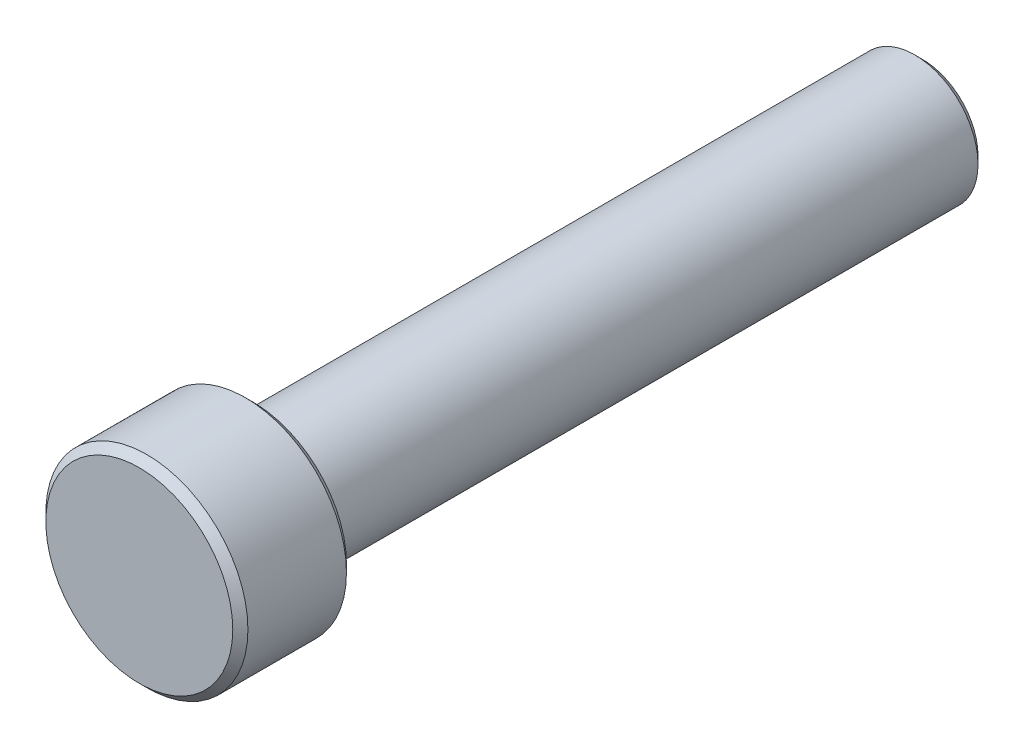
ISO-10303-21;
HEADER;
FILE_DESCRIPTION(('STEP AP214'),'2;1');
FILE_NAME('part.step','',(''),(''),'','','');
FILE_SCHEMA(('AUTOMOTIVE_DESIGN { 1 0 10303 214 1 1 1 1 }'));
ENDSEC;
DATA;
#1=APPLICATION_CONTEXT('core data for automotive mechanical design processes');
#2=APPLICATION_PROTOCOL_DEFINITION('international standard','automotive_design',2000,#1);
#3=PRODUCT_CONTEXT('',#1,'mechanical');
#4=PRODUCT('Part','Part','',(#3));
#5=PRODUCT_RELATED_PRODUCT_CATEGORY('part','',(#4));
#6=PRODUCT_DEFINITION_FORMATION('','',#4);
#7=PRODUCT_DEFINITION_CONTEXT('part definition',#1,'design');
#8=PRODUCT_DEFINITION('design','',#6,#7);
#9=PRODUCT_DEFINITION_SHAPE('','',#8);
#10=(LENGTH_UNIT() NAMED_UNIT(*) SI_UNIT(.MILLI.,.METRE.));
#11=(NAMED_UNIT(*) PLANE_ANGLE_UNIT() SI_UNIT($,.RADIAN.));
#12=(NAMED_UNIT(*) SI_UNIT($,.STERADIAN.) SOLID_ANGLE_UNIT());
#13=UNCERTAINTY_MEASURE_WITH_UNIT(LENGTH_MEASURE(1.E-05),#10,'distance_accuracy_value','');
#14=(GEOMETRIC_REPRESENTATION_CONTEXT(3) GLOBAL_UNCERTAINTY_ASSIGNED_CONTEXT((#13)) GLOBAL_UNIT_ASSIGNED_CONTEXT((#10,
#11,#12)) REPRESENTATION_CONTEXT('',''));
#15=CARTESIAN_POINT('',(0.,0.,0.));
#16=DIRECTION('',(0.,0.,1.));
#17=DIRECTION('',(1.,0.,0.));
#18=AXIS2_PLACEMENT_3D('',#15,#16,#17);
#19=CARTESIAN_POINT('',(0.,0.,26.5));
#20=DIRECTION('',(0.,0.,-1.));
#21=DIRECTION('',(-1.,0.,0.));
#22=AXIS2_PLACEMENT_3D('',#19,#20,#21);
#23=CYLINDRICAL_SURFACE('',#22,2.5);
#24=CARTESIAN_POINT('',(0.,0.,0.299999999999998));
#25=DIRECTION('',(0.,0.,1.));
#26=DIRECTION('',(1.,0.,0.));
#27=AXIS2_PLACEMENT_3D('',#24,#25,#26);
#28=CIRCLE('',#27,2.5);
#29=CARTESIAN_POINT('',(2.5,0.,0.299999999999998));
#30=VERTEX_POINT('',#29);
#31=EDGE_CURVE('E72',#30,#30,#28,.T.);
#32=ORIENTED_EDGE('',*,*,#31,.T.);
#33=EDGE_LOOP('',(#32));
#34=FACE_BOUND('',#33,.T.);
#35=CARTESIAN_POINT('',(0.,0.,26.5));
#36=DIRECTION('',(0.,0.,1.));
#37=DIRECTION('',(1.,0.,0.));
#38=AXIS2_PLACEMENT_3D('',#35,#36,#37);
#39=CIRCLE('',#38,2.5);
#40=CARTESIAN_POINT('',(2.5,0.,26.5));
#41=VERTEX_POINT('',#40);
#42=EDGE_CURVE('E76',#41,#41,#39,.T.);
#43=ORIENTED_EDGE('',*,*,#42,.F.);
#44=EDGE_LOOP('',(#43));
#45=FACE_BOUND('',#44,.T.);
#46=ADVANCED_FACE('F43',(#34,#45),#23,.T.);
#47=CARTESIAN_POINT('',(0.,0.,0.));
#48=DIRECTION('',(0.,0.,1.));
#49=DIRECTION('',(1.,0.,0.));
#50=AXIS2_PLACEMENT_3D('',#47,#48,#49);
#51=PLANE('',#50);
#52=CARTESIAN_POINT('',(0.,0.,0.));
#53=DIRECTION('',(0.,0.,1.));
#54=DIRECTION('',(1.,0.,0.));
#55=AXIS2_PLACEMENT_3D('',#52,#53,#54);
#56=CIRCLE('',#55,2.2);
#57=CARTESIAN_POINT('',(2.2,0.,0.));
#58=VERTEX_POINT('',#57);
#59=EDGE_CURVE('E68',#58,#58,#56,.F.);
#60=ORIENTED_EDGE('',*,*,#59,.T.);
#61=EDGE_LOOP('',(#60));
#62=FACE_BOUND('',#61,.T.);
#63=ADVANCED_FACE('F84',(#62),#51,.F.);
#64=CARTESIAN_POINT('',(0.,0.,31.));
#65=DIRECTION('',(0.,0.,-1.));
#66=DIRECTION('',(-1.,0.,0.));
#67=AXIS2_PLACEMENT_3D('',#64,#65,#66);
#68=CYLINDRICAL_SURFACE('',#67,4.);
#69=CARTESIAN_POINT('',(0.,0.,26.8));
#70=DIRECTION('',(0.,0.,1.));
#71=DIRECTION('',(1.,0.,0.));
#72=AXIS2_PLACEMENT_3D('',#69,#70,#71);
#73=CIRCLE('',#72,4.);
#74=CARTESIAN_POINT('',(4.,0.,26.8));
#75=VERTEX_POINT('',#74);
#76=EDGE_CURVE('E57',#75,#75,#73,.T.);
#77=ORIENTED_EDGE('',*,*,#76,.T.);
#78=EDGE_LOOP('',(#77));
#79=FACE_BOUND('',#78,.T.);
#80=CARTESIAN_POINT('',(0.,0.,30.7));
#81=DIRECTION('',(0.,0.,1.));
#82=DIRECTION('',(1.,0.,0.));
#83=AXIS2_PLACEMENT_3D('',#80,#81,#82);
#84=CIRCLE('',#83,4.);
#85=CARTESIAN_POINT('',(4.,0.,30.7));
#86=VERTEX_POINT('',#85);
#87=EDGE_CURVE('E62',#86,#86,#84,.F.);
#88=ORIENTED_EDGE('',*,*,#87,.T.);
#89=EDGE_LOOP('',(#88));
#90=FACE_BOUND('',#89,.T.);
#91=ADVANCED_FACE('F90',(#79,#90),#68,.T.);
#92=CARTESIAN_POINT('',(0.,0.,31.));
#93=DIRECTION('',(0.,0.,1.));
#94=DIRECTION('',(1.,0.,0.));
#95=AXIS2_PLACEMENT_3D('',#92,#93,#94);
#96=PLANE('',#95);
#97=CARTESIAN_POINT('',(0.,0.,31.));
#98=DIRECTION('',(0.,0.,1.));
#99=DIRECTION('',(1.,0.,0.));
#100=AXIS2_PLACEMENT_3D('',#97,#98,#99);
#101=CIRCLE('',#100,3.70000000000001);
#102=CARTESIAN_POINT('',(3.70000000000001,0.,31.));
#103=VERTEX_POINT('',#102);
#104=EDGE_CURVE('E10',#103,#103,#101,.T.);
#105=ORIENTED_EDGE('',*,*,#104,.T.);
#106=EDGE_LOOP('',(#105));
#107=FACE_BOUND('',#106,.T.);
#108=ADVANCED_FACE('F116',(#107),#96,.T.);
#109=CARTESIAN_POINT('',(0.,0.,26.5));
#110=DIRECTION('',(0.,0.,1.));
#111=DIRECTION('',(1.,0.,0.));
#112=AXIS2_PLACEMENT_3D('',#109,#110,#111);
#113=PLANE('',#112);
#114=CARTESIAN_POINT('',(0.,0.,26.5));
#115=DIRECTION('',(0.,0.,1.));
#116=DIRECTION('',(1.,0.,0.));
#117=AXIS2_PLACEMENT_3D('',#114,#115,#116);
#118=CIRCLE('',#117,3.7);
#119=CARTESIAN_POINT('',(3.7,0.,26.5));
#120=VERTEX_POINT('',#119);
#121=EDGE_CURVE('E52',#120,#120,#118,.F.);
#122=ORIENTED_EDGE('',*,*,#121,.T.);
#123=EDGE_LOOP('',(#122));
#124=FACE_BOUND('',#123,.T.);
#125=ORIENTED_EDGE('',*,*,#42,.T.);
#126=EDGE_LOOP('',(#125));
#127=FACE_BOUND('',#126,.T.);
#128=ADVANCED_FACE('F81',(#124,#127),#113,.F.);
#129=CARTESIAN_POINT('',(0.,0.,0.299999999999998));
#130=DIRECTION('',(0.,0.,1.));
#131=DIRECTION('',(1.,0.,0.));
#132=AXIS2_PLACEMENT_3D('',#129,#130,#131);
#133=CONICAL_SURFACE('',#132,2.5,0.785398163397455);
#134=ORIENTED_EDGE('',*,*,#59,.F.);
#135=EDGE_LOOP('',(#134));
#136=FACE_BOUND('',#135,.T.);
#137=ORIENTED_EDGE('',*,*,#31,.F.);
#138=EDGE_LOOP('',(#137));
#139=FACE_BOUND('',#138,.T.);
#140=ADVANCED_FACE('F96',(#136,#139),#133,.T.);
#141=CARTESIAN_POINT('',(0.,0.,26.8));
#142=DIRECTION('',(0.,0.,1.));
#143=DIRECTION('',(1.,0.,0.));
#144=AXIS2_PLACEMENT_3D('',#141,#142,#143);
#145=CONICAL_SURFACE('',#144,4.,0.785398163397448);
#146=ORIENTED_EDGE('',*,*,#121,.F.);
#147=EDGE_LOOP('',(#146));
#148=FACE_BOUND('',#147,.T.);
#149=ORIENTED_EDGE('',*,*,#76,.F.);
#150=EDGE_LOOP('',(#149));
#151=FACE_BOUND('',#150,.T.);
#152=ADVANCED_FACE('F101',(#148,#151),#145,.T.);
#153=CARTESIAN_POINT('',(0.,0.,31.));
#154=DIRECTION('',(0.,0.,-1.));
#155=DIRECTION('',(-1.,0.,0.));
#156=AXIS2_PLACEMENT_3D('',#153,#154,#155);
#157=CONICAL_SURFACE('',#156,3.70000000000001,0.785398163397437);
#158=ORIENTED_EDGE('',*,*,#87,.F.);
#159=EDGE_LOOP('',(#158));
#160=FACE_BOUND('',#159,.T.);
#161=ORIENTED_EDGE('',*,*,#104,.F.);
#162=EDGE_LOOP('',(#161));
#163=FACE_BOUND('',#162,.T.);
#164=ADVANCED_FACE('F46',(#160,#163),#157,.T.);
#165=CLOSED_SHELL('',(#46,#63,#91,#108,#128,#140,#152,#164));
#166=MANIFOLD_SOLID_BREP('B2',#165);
#167=ADVANCED_BREP_SHAPE_REPRESENTATION('',(#18,#166),#14);
#168=SHAPE_DEFINITION_REPRESENTATION(#9,#167);
ENDSEC;
END-ISO-10303-21;
